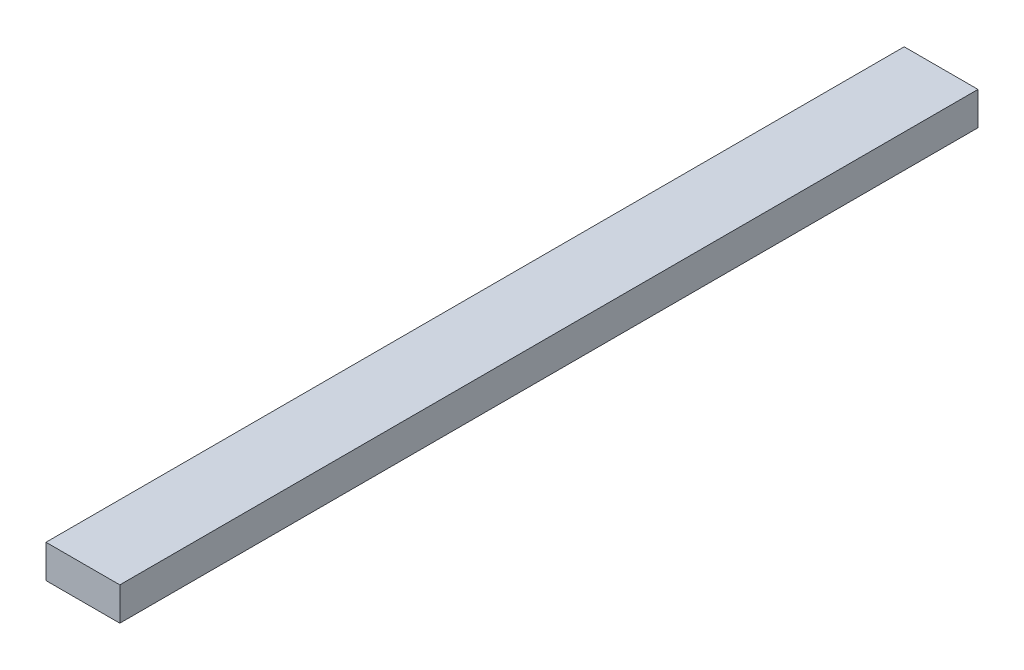
ISO-10303-21;
HEADER;
FILE_DESCRIPTION(('STEP AP214'),'2;1');
FILE_NAME('part.step','',(''),(''),'','','');
FILE_SCHEMA(('AUTOMOTIVE_DESIGN { 1 0 10303 214 1 1 1 1 }'));
ENDSEC;
DATA;
#1=APPLICATION_CONTEXT('core data for automotive mechanical design processes');
#2=APPLICATION_PROTOCOL_DEFINITION('international standard','automotive_design',2000,#1);
#3=PRODUCT_CONTEXT('',#1,'mechanical');
#4=PRODUCT('Part','Part','',(#3));
#5=PRODUCT_RELATED_PRODUCT_CATEGORY('part','',(#4));
#6=PRODUCT_DEFINITION_FORMATION('','',#4);
#7=PRODUCT_DEFINITION_CONTEXT('part definition',#1,'design');
#8=PRODUCT_DEFINITION('design','',#6,#7);
#9=PRODUCT_DEFINITION_SHAPE('','',#8);
#10=(LENGTH_UNIT() NAMED_UNIT(*) SI_UNIT(.MILLI.,.METRE.));
#11=(NAMED_UNIT(*) PLANE_ANGLE_UNIT() SI_UNIT($,.RADIAN.));
#12=(NAMED_UNIT(*) SI_UNIT($,.STERADIAN.) SOLID_ANGLE_UNIT());
#13=UNCERTAINTY_MEASURE_WITH_UNIT(LENGTH_MEASURE(1.E-05),#10,'distance_accuracy_value','');
#14=(GEOMETRIC_REPRESENTATION_CONTEXT(3) GLOBAL_UNCERTAINTY_ASSIGNED_CONTEXT((#13)) GLOBAL_UNIT_ASSIGNED_CONTEXT((#10,
#11,#12)) REPRESENTATION_CONTEXT('',''));
#15=CARTESIAN_POINT('',(0.,0.,0.));
#16=DIRECTION('',(0.,0.,1.));
#17=DIRECTION('',(1.,0.,0.));
#18=AXIS2_PLACEMENT_3D('',#15,#16,#17);
#19=CARTESIAN_POINT('',(20.,-9.,465.));
#20=DIRECTION('',(-1.,0.,0.));
#21=DIRECTION('',(0.,0.,1.));
#22=AXIS2_PLACEMENT_3D('',#19,#20,#21);
#23=PLANE('',#22);
#24=DIRECTION('',(0.,1.,0.));
#25=VECTOR('',#24,1.);
#26=CARTESIAN_POINT('',(20.,-9.,0.));
#27=LINE('',#26,#25);
#28=CARTESIAN_POINT('',(20.,-9.,0.));
#29=VERTEX_POINT('',#28);
#30=CARTESIAN_POINT('',(20.,9.,0.));
#31=VERTEX_POINT('',#30);
#32=EDGE_CURVE('E97',#29,#31,#27,.T.);
#33=ORIENTED_EDGE('',*,*,#32,.T.);
#34=DIRECTION('',(0.,0.,-1.));
#35=VECTOR('',#34,1.);
#36=CARTESIAN_POINT('',(20.,9.,465.));
#37=LINE('',#36,#35);
#38=CARTESIAN_POINT('',(20.,9.,465.));
#39=VERTEX_POINT('',#38);
#40=EDGE_CURVE('E11',#39,#31,#37,.T.);
#41=ORIENTED_EDGE('',*,*,#40,.F.);
#42=DIRECTION('',(0.,1.,0.));
#43=VECTOR('',#42,1.);
#44=CARTESIAN_POINT('',(20.,-9.,465.));
#45=LINE('',#44,#43);
#46=CARTESIAN_POINT('',(20.,-9.,465.));
#47=VERTEX_POINT('',#46);
#48=EDGE_CURVE('E85',#47,#39,#45,.T.);
#49=ORIENTED_EDGE('',*,*,#48,.F.);
#50=DIRECTION('',(0.,0.,-1.));
#51=VECTOR('',#50,1.);
#52=CARTESIAN_POINT('',(20.,-9.,465.));
#53=LINE('',#52,#51);
#54=EDGE_CURVE('E93',#47,#29,#53,.T.);
#55=ORIENTED_EDGE('',*,*,#54,.T.);
#56=EDGE_LOOP('',(#33,#41,#49,#55));
#57=FACE_BOUND('',#56,.T.);
#58=ADVANCED_FACE('F34',(#57),#23,.F.);
#59=CARTESIAN_POINT('',(-20.,9.,465.));
#60=DIRECTION('',(0.,-1.,0.));
#61=DIRECTION('',(0.,0.,-1.));
#62=AXIS2_PLACEMENT_3D('',#59,#60,#61);
#63=PLANE('',#62);
#64=DIRECTION('',(-1.,0.,0.));
#65=VECTOR('',#64,1.);
#66=CARTESIAN_POINT('',(-20.,9.,0.));
#67=LINE('',#66,#65);
#68=CARTESIAN_POINT('',(-20.,9.,0.));
#69=VERTEX_POINT('',#68);
#70=EDGE_CURVE('E89',#31,#69,#67,.T.);
#71=ORIENTED_EDGE('',*,*,#70,.T.);
#72=DIRECTION('',(0.,0.,-1.));
#73=VECTOR('',#72,1.);
#74=CARTESIAN_POINT('',(-20.,9.,465.));
#75=LINE('',#74,#73);
#76=CARTESIAN_POINT('',(-20.,9.,465.));
#77=VERTEX_POINT('',#76);
#78=EDGE_CURVE('E42',#77,#69,#75,.T.);
#79=ORIENTED_EDGE('',*,*,#78,.F.);
#80=DIRECTION('',(-1.,0.,0.));
#81=VECTOR('',#80,1.);
#82=CARTESIAN_POINT('',(-20.,9.,465.));
#83=LINE('',#82,#81);
#84=EDGE_CURVE('E80',#39,#77,#83,.T.);
#85=ORIENTED_EDGE('',*,*,#84,.F.);
#86=ORIENTED_EDGE('',*,*,#40,.T.);
#87=EDGE_LOOP('',(#71,#79,#85,#86));
#88=FACE_BOUND('',#87,.T.);
#89=ADVANCED_FACE('F88',(#88),#63,.F.);
#90=CARTESIAN_POINT('',(-20.,-9.,465.));
#91=DIRECTION('',(1.,0.,0.));
#92=DIRECTION('',(0.,0.,-1.));
#93=AXIS2_PLACEMENT_3D('',#90,#91,#92);
#94=PLANE('',#93);
#95=DIRECTION('',(0.,-1.,0.));
#96=VECTOR('',#95,1.);
#97=CARTESIAN_POINT('',(-20.,-9.,0.));
#98=LINE('',#97,#96);
#99=CARTESIAN_POINT('',(-20.,-9.,0.));
#100=VERTEX_POINT('',#99);
#101=EDGE_CURVE('E67',#69,#100,#98,.T.);
#102=ORIENTED_EDGE('',*,*,#101,.T.);
#103=DIRECTION('',(0.,0.,-1.));
#104=VECTOR('',#103,1.);
#105=CARTESIAN_POINT('',(-20.,-9.,465.));
#106=LINE('',#105,#104);
#107=CARTESIAN_POINT('',(-20.,-9.,465.));
#108=VERTEX_POINT('',#107);
#109=EDGE_CURVE('E90',#108,#100,#106,.T.);
#110=ORIENTED_EDGE('',*,*,#109,.F.);
#111=DIRECTION('',(0.,-1.,0.));
#112=VECTOR('',#111,1.);
#113=CARTESIAN_POINT('',(-20.,-9.,465.));
#114=LINE('',#113,#112);
#115=EDGE_CURVE('E83',#77,#108,#114,.T.);
#116=ORIENTED_EDGE('',*,*,#115,.F.);
#117=ORIENTED_EDGE('',*,*,#78,.T.);
#118=EDGE_LOOP('',(#102,#110,#116,#117));
#119=FACE_BOUND('',#118,.T.);
#120=ADVANCED_FACE('F91',(#119),#94,.F.);
#121=CARTESIAN_POINT('',(-20.,-9.,465.));
#122=DIRECTION('',(0.,1.,0.));
#123=DIRECTION('',(0.,0.,1.));
#124=AXIS2_PLACEMENT_3D('',#121,#122,#123);
#125=PLANE('',#124);
#126=DIRECTION('',(1.,0.,0.));
#127=VECTOR('',#126,1.);
#128=CARTESIAN_POINT('',(-20.,-9.,0.));
#129=LINE('',#128,#127);
#130=EDGE_CURVE('E73',#100,#29,#129,.T.);
#131=ORIENTED_EDGE('',*,*,#130,.T.);
#132=ORIENTED_EDGE('',*,*,#54,.F.);
#133=DIRECTION('',(1.,0.,0.));
#134=VECTOR('',#133,1.);
#135=CARTESIAN_POINT('',(-20.,-9.,465.));
#136=LINE('',#135,#134);
#137=EDGE_CURVE('E50',#108,#47,#136,.T.);
#138=ORIENTED_EDGE('',*,*,#137,.F.);
#139=ORIENTED_EDGE('',*,*,#109,.T.);
#140=EDGE_LOOP('',(#131,#132,#138,#139));
#141=FACE_BOUND('',#140,.T.);
#142=ADVANCED_FACE('F104',(#141),#125,.F.);
#143=CARTESIAN_POINT('',(0.,0.,465.));
#144=DIRECTION('',(0.,0.,-1.));
#145=DIRECTION('',(-1.,0.,0.));
#146=AXIS2_PLACEMENT_3D('',#143,#144,#145);
#147=PLANE('',#146);
#148=ORIENTED_EDGE('',*,*,#48,.T.);
#149=ORIENTED_EDGE('',*,*,#84,.T.);
#150=ORIENTED_EDGE('',*,*,#115,.T.);
#151=ORIENTED_EDGE('',*,*,#137,.T.);
#152=EDGE_LOOP('',(#148,#149,#150,#151));
#153=FACE_BOUND('',#152,.T.);
#154=ADVANCED_FACE('F81',(#153),#147,.F.);
#155=CARTESIAN_POINT('',(0.,0.,0.));
#156=DIRECTION('',(0.,0.,-1.));
#157=DIRECTION('',(-1.,0.,0.));
#158=AXIS2_PLACEMENT_3D('',#155,#156,#157);
#159=PLANE('',#158);
#160=ORIENTED_EDGE('',*,*,#32,.F.);
#161=ORIENTED_EDGE('',*,*,#130,.F.);
#162=ORIENTED_EDGE('',*,*,#101,.F.);
#163=ORIENTED_EDGE('',*,*,#70,.F.);
#164=EDGE_LOOP('',(#160,#161,#162,#163));
#165=FACE_BOUND('',#164,.T.);
#166=ADVANCED_FACE('F107',(#165),#159,.T.);
#167=CLOSED_SHELL('',(#58,#89,#120,#142,#154,#166));
#168=MANIFOLD_SOLID_BREP('B2',#167);
#169=ADVANCED_BREP_SHAPE_REPRESENTATION('',(#18,#168),#14);
#170=SHAPE_DEFINITION_REPRESENTATION(#9,#169);
ENDSEC;
END-ISO-10303-21;
